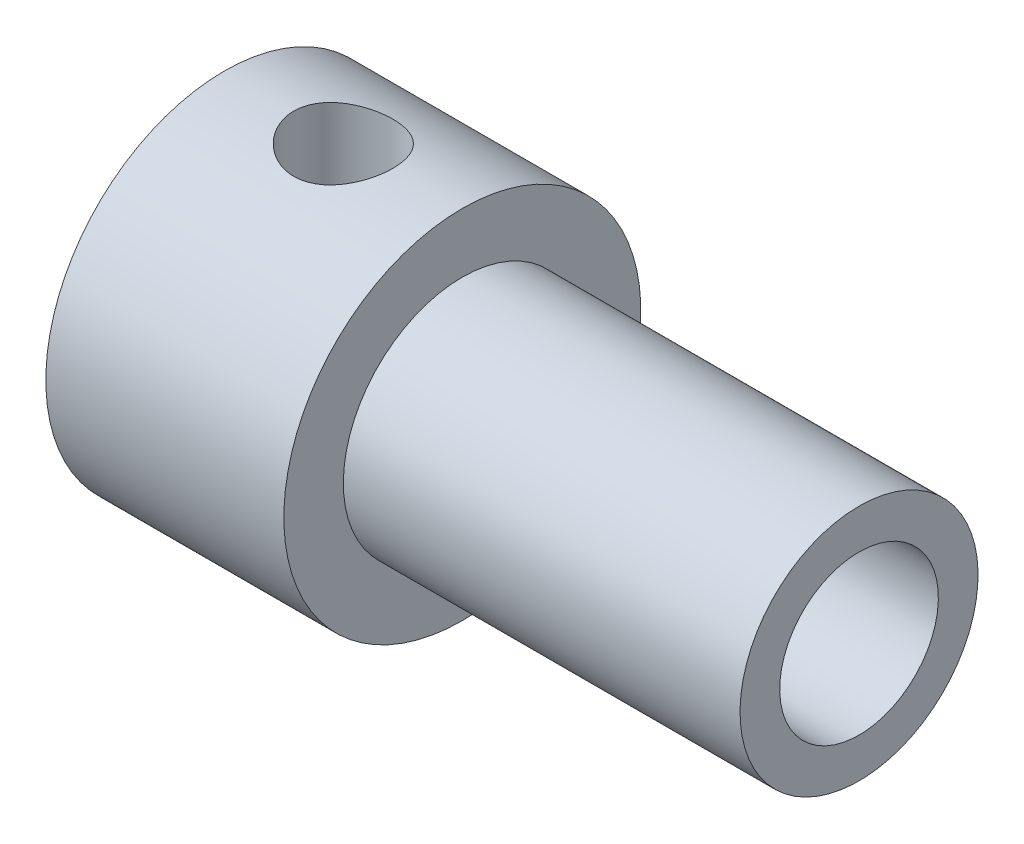
ISO-10303-21;
HEADER;
FILE_DESCRIPTION(('STEP AP214'),'2;1');
FILE_NAME('part.step','',(''),(''),'','','');
FILE_SCHEMA(('AUTOMOTIVE_DESIGN { 1 0 10303 214 1 1 1 1 }'));
ENDSEC;
DATA;
#1=APPLICATION_CONTEXT('core data for automotive mechanical design processes');
#2=APPLICATION_PROTOCOL_DEFINITION('international standard','automotive_design',2000,#1);
#3=PRODUCT_CONTEXT('',#1,'mechanical');
#4=PRODUCT('Part','Part','',(#3));
#5=PRODUCT_RELATED_PRODUCT_CATEGORY('part','',(#4));
#6=PRODUCT_DEFINITION_FORMATION('','',#4);
#7=PRODUCT_DEFINITION_CONTEXT('part definition',#1,'design');
#8=PRODUCT_DEFINITION('design','',#6,#7);
#9=PRODUCT_DEFINITION_SHAPE('','',#8);
#10=(LENGTH_UNIT() NAMED_UNIT(*) SI_UNIT(.MILLI.,.METRE.));
#11=(NAMED_UNIT(*) PLANE_ANGLE_UNIT() SI_UNIT($,.RADIAN.));
#12=(NAMED_UNIT(*) SI_UNIT($,.STERADIAN.) SOLID_ANGLE_UNIT());
#13=UNCERTAINTY_MEASURE_WITH_UNIT(LENGTH_MEASURE(1.E-05),#10,'distance_accuracy_value','');
#14=(GEOMETRIC_REPRESENTATION_CONTEXT(3) GLOBAL_UNCERTAINTY_ASSIGNED_CONTEXT((#13)) GLOBAL_UNIT_ASSIGNED_CONTEXT((#10,
#11,#12)) REPRESENTATION_CONTEXT('',''));
#15=CARTESIAN_POINT('',(0.,0.,0.));
#16=DIRECTION('',(0.,0.,1.));
#17=DIRECTION('',(1.,0.,0.));
#18=AXIS2_PLACEMENT_3D('',#15,#16,#17);
#19=CARTESIAN_POINT('',(0.,-2.,0.));
#20=DIRECTION('',(1.,0.,0.));
#21=DIRECTION('',(0.,1.,0.));
#22=AXIS2_PLACEMENT_3D('',#19,#20,#21);
#23=CYLINDRICAL_SURFACE('',#22,2.);
#24=CARTESIAN_POINT('',(-14.25,0.,0.));
#25=CARTESIAN_POINT('',(-14.2499956500012,-4.04694687398822E-06,-0.0635104730002027));
#26=CARTESIAN_POINT('',(-14.2451269881822,-0.00305676688999323,-0.127096441053758));
#27=CARTESIAN_POINT('',(-14.2259141965705,-0.0149783227589793,-0.252318262265282));
#28=CARTESIAN_POINT('',(-14.2115520060745,-0.0238582442510421,-0.313950163299073));
#29=CARTESIAN_POINT('',(-14.1741886368379,-0.0465414701786574,-0.433205558136783));
#30=CARTESIAN_POINT('',(-14.1512302121591,-0.0603203922133728,-0.490847243665017));
#31=CARTESIAN_POINT('',(-14.0976141492032,-0.0916540151392698,-0.60126036886836));
#32=CARTESIAN_POINT('',(-14.0669573639908,-0.10920829764729,-0.654032347276152));
#33=CARTESIAN_POINT('',(-13.996113426815,-0.148298470977271,-0.757974192167973));
#34=CARTESIAN_POINT('',(-13.9553607000245,-0.170040377753832,-0.808679560769977));
#35=CARTESIAN_POINT('',(-13.8667808254934,-0.214686500863683,-0.90298637514676));
#36=CARTESIAN_POINT('',(-13.8189441717421,-0.237592251414473,-0.946578107215733));
#37=CARTESIAN_POINT('',(-13.7099661057955,-0.285695813448014,-1.03142873237132));
#38=CARTESIAN_POINT('',(-13.6479002133927,-0.310783890065879,-1.07157206029151));
#39=CARTESIAN_POINT('',(-13.5164351845528,-0.35669801871269,-1.14073966020039));
#40=CARTESIAN_POINT('',(-13.4470486874239,-0.377531240037616,-1.16978270899534));
#41=CARTESIAN_POINT('',(-13.3211894762213,-0.406904243726358,-1.2093340058598));
#42=CARTESIAN_POINT('',(-13.2660331814612,-0.417230940099262,-1.22269552371393));
#43=CARTESIAN_POINT('',(-13.1536940743892,-0.432186426741945,-1.2418184358548));
#44=CARTESIAN_POINT('',(-13.0965142417255,-0.436823263263077,-1.24759056342088));
#45=CARTESIAN_POINT('',(-12.9815869832489,-0.439701142171729,-1.2511891824572));
#46=CARTESIAN_POINT('',(-12.9238384635376,-0.437925412282815,-1.24899483727851));
#47=CARTESIAN_POINT('',(-12.809689896811,-0.428225976160802,-1.23676317046804));
#48=CARTESIAN_POINT('',(-12.7532909679609,-0.420297342328898,-1.22671956265043));
#49=CARTESIAN_POINT('',(-12.6445615473425,-0.399674268782194,-1.19968103371474));
#50=CARTESIAN_POINT('',(-12.5921675443157,-0.387092848951863,-1.18285016736897));
#51=CARTESIAN_POINT('',(-12.4908388175946,-0.358544335565944,-1.14290189820938));
#52=CARTESIAN_POINT('',(-12.4419053251255,-0.342576044986466,-1.11978227193696));
#53=CARTESIAN_POINT('',(-12.3391667261673,-0.305451840069805,-1.06294892954949));
#54=CARTESIAN_POINT('',(-12.2861591898796,-0.283884084240411,-1.0280629660117));
#55=CARTESIAN_POINT('',(-12.1861697209995,-0.239942882087568,-0.950881463002103));
#56=CARTESIAN_POINT('',(-12.1391940682935,-0.217568626640245,-0.908578308011438));
#57=CARTESIAN_POINT('',(-12.0446982506296,-0.170201050831433,-0.809519713023332));
#58=CARTESIAN_POINT('',(-11.9983670257412,-0.145384683234071,-0.751531353595334));
#59=CARTESIAN_POINT('',(-11.9161491041128,-0.0997194493755531,-0.62714809959357));
#60=CARTESIAN_POINT('',(-11.8802583022711,-0.0788690248523625,-0.560756523881999));
#61=CARTESIAN_POINT('',(-11.8222363116186,-0.0444662703868383,-0.424883562934749));
#62=CARTESIAN_POINT('',(-11.7994659600188,-0.03058023408426,-0.355763457732371));
#63=CARTESIAN_POINT('',(-11.7662350720172,-0.0101507068995191,-0.213612154574977));
#64=CARTESIAN_POINT('',(-11.755757105778,-0.00359682009930077,-0.140586648341306));
#65=CARTESIAN_POINT('',(-11.7484341499388,0.000978405400911449,-0.00451561874059017));
#66=CARTESIAN_POINT('',(-11.7497968220461,0.000121613455105019,0.0584027741637829));
#67=CARTESIAN_POINT('',(-11.7618828284207,-0.00741098505673247,0.182972117996307));
#68=CARTESIAN_POINT('',(-11.7726055250922,-0.0140863952640859,0.244623154962732));
#69=CARTESIAN_POINT('',(-11.802238536692,-0.0322594771693028,0.362521070658188));
#70=CARTESIAN_POINT('',(-11.8208121567966,-0.0435582947315621,0.418885009953202));
#71=CARTESIAN_POINT('',(-11.8652963892786,-0.070043158952486,0.527638281070987));
#72=CARTESIAN_POINT('',(-11.8912082302552,-0.0852298564973361,0.580026945470713));
#73=CARTESIAN_POINT('',(-11.9525152059955,-0.120099876439996,0.685084056277256));
#74=CARTESIAN_POINT('',(-11.9886035692382,-0.140082351827755,0.737246967843403));
#75=CARTESIAN_POINT('',(-12.0677938651528,-0.181930299982833,0.83514264021734));
#76=CARTESIAN_POINT('',(-12.1109035892545,-0.20379785173616,0.880868151291853));
#77=CARTESIAN_POINT('',(-12.2101350394127,-0.250941302869087,0.971474198022882));
#78=CARTESIAN_POINT('',(-12.2672372062948,-0.276251165850429,1.01526851939752));
#79=CARTESIAN_POINT('',(-12.3888757849443,-0.324332372518279,1.09280351885684));
#80=CARTESIAN_POINT('',(-12.453407006753,-0.347105466776638,1.12655115718693));
#81=CARTESIAN_POINT('',(-12.5746921480569,-0.38266469685408,1.17684772011828));
#82=CARTESIAN_POINT('',(-12.6302407507322,-0.396543638062203,1.19551895865479));
#83=CARTESIAN_POINT('',(-12.7443931457689,-0.418949693362328,1.22500108205245));
#84=CARTESIAN_POINT('',(-12.8029920094515,-0.427485167573945,1.23582424983127));
#85=CARTESIAN_POINT('',(-12.9220902768807,-0.437936750112685,1.24901383653654));
#86=CARTESIAN_POINT('',(-12.9825985854882,-0.439814983254312,1.25133186963292));
#87=CARTESIAN_POINT('',(-13.103130960366,-0.436509368901527,1.24719778716817));
#88=CARTESIAN_POINT('',(-13.1631548590095,-0.431323174044142,1.24074275650142));
#89=CARTESIAN_POINT('',(-13.2760297950514,-0.41544611228666,1.22038272403399));
#90=CARTESIAN_POINT('',(-13.3290693014164,-0.405231919489398,1.2071191949977));
#91=CARTESIAN_POINT('',(-13.4321350595859,-0.380824695643097,1.17417623469513));
#92=CARTESIAN_POINT('',(-13.4821600445375,-0.366630005762726,1.15449412799407));
#93=CARTESIAN_POINT('',(-13.5855967438727,-0.333360971134819,1.10602690439618));
#94=CARTESIAN_POINT('',(-13.6384502984766,-0.313877695010031,1.0763364445546));
#95=CARTESIAN_POINT('',(-13.738938367246,-0.273322935881322,1.0100001703639));
#96=CARTESIAN_POINT('',(-13.7865686125605,-0.252250177231749,0.973348732866944));
#97=CARTESIAN_POINT('',(-13.8850142549778,-0.205980892688188,0.885670221416065));
#98=CARTESIAN_POINT('',(-13.9345908454455,-0.18079458191224,0.833233674246799));
#99=CARTESIAN_POINT('',(-14.0244948297052,-0.133012709432523,0.719822446025209));
#100=CARTESIAN_POINT('',(-14.0648164959274,-0.110418756356055,0.658842515138555));
#101=CARTESIAN_POINT('',(-14.1347711301241,-0.0701328902345195,0.529355399891413));
#102=CARTESIAN_POINT('',(-14.1643860054058,-0.0524492864464374,0.460835727056575));
#103=CARTESIAN_POINT('',(-14.2110718843317,-0.0241847836215768,0.318394712729504));
#104=CARTESIAN_POINT('',(-14.2281872348698,-0.0135787857131109,0.244493501106854));
#105=CARTESIAN_POINT('',(-14.2422992091626,-0.00480527831856997,0.141418481224667));
#106=CARTESIAN_POINT('',(-14.245181865334,-0.00300827773698841,0.113248608862872));
#107=CARTESIAN_POINT('',(-14.2490332915376,-0.000604697867604981,0.0567241864870907));
#108=CARTESIAN_POINT('',(-14.25000194311,1.80773910696459E-06,0.0283696251514532));
#109=CARTESIAN_POINT('',(-14.25,0.,0.));
#110=B_SPLINE_CURVE_WITH_KNOTS('',3,(#24,#25,#26,#27,#28,#29,#30,#31,#32,#33,#34,#35,#36,#37,
#38,#39,#40,#41,#42,#43,#44,#45,#46,#47,#48,#49,#50,#51,#52,#53,#54,#55,#56,#57,#58,#59,#60,#61,
#62,#63,#64,#65,#66,#67,#68,#69,#70,#71,#72,#73,#74,#75,#76,#77,#78,#79,#80,#81,#82,#83,#84,#85,
#86,#87,#88,#89,#90,#91,#92,#93,#94,#95,#96,#97,#98,#99,#100,#101,#102,#103,#104,#105,#106,#107,
#108,#109),.UNSPECIFIED.,.T.,.F.,(4,2,2,2,2,2,2,2,2,2,2,2,2,2,2,2,2,2,2,2,2,2,2,2,2,2,2,2,2,2,2,
2,2,2,2,2,2,2,2,2,2,2,4),(0.,0.190412301434133,0.381187894128462,0.571026987595136,
0.760845054038795,0.965821870536219,1.17107628325702,1.40412975852973,1.6367872460701,
1.80912008879717,1.98120894707391,2.15374823498778,2.32642584505083,2.49515839460436,
2.66395067908033,2.86427450354359,3.06480522575182,3.29842180699522,3.53194640727861,
3.75284174135959,3.9734234795813,4.16127180597572,4.3491073373228,4.52959504531298,
4.71011298928466,4.90885230990552,5.10781368827686,5.33565708863713,5.5633422719691,
5.7432994031372,5.92297427413352,6.103669746882,6.28442527563864,6.45063169037741,
6.61690747313442,6.80725523036979,6.99775741153769,7.22600539035111,7.45439424578499,
7.68316725607077,7.91112460944407,7.9961750123248,8.08123067890588),.UNSPECIFIED.);
#111=CARTESIAN_POINT('',(-14.25,0.,0.));
#112=VERTEX_POINT('',#111);
#113=EDGE_CURVE('E60',#112,#112,#110,.T.);
#114=ORIENTED_EDGE('',*,*,#113,.F.);
#115=EDGE_LOOP('',(#114));
#116=FACE_BOUND('',#115,.T.);
#117=CARTESIAN_POINT('',(0.,-2.,0.));
#118=DIRECTION('',(1.,0.,0.));
#119=DIRECTION('',(0.,1.,0.));
#120=AXIS2_PLACEMENT_3D('',#117,#118,#119);
#121=CIRCLE('',#120,2.);
#122=CARTESIAN_POINT('',(0.,0.,0.));
#123=VERTEX_POINT('',#122);
#124=EDGE_CURVE('E10',#123,#123,#121,.T.);
#125=ORIENTED_EDGE('',*,*,#124,.T.);
#126=EDGE_LOOP('',(#125));
#127=FACE_BOUND('',#126,.T.);
#128=CARTESIAN_POINT('',(-16.,-2.,0.));
#129=DIRECTION('',(1.,0.,0.));
#130=DIRECTION('',(0.,1.,0.));
#131=AXIS2_PLACEMENT_3D('',#128,#129,#130);
#132=CIRCLE('',#131,2.);
#133=CARTESIAN_POINT('',(-16.,0.,0.));
#134=VERTEX_POINT('',#133);
#135=EDGE_CURVE('E57',#134,#134,#132,.T.);
#136=ORIENTED_EDGE('',*,*,#135,.F.);
#137=EDGE_LOOP('',(#136));
#138=FACE_BOUND('',#137,.T.);
#139=ADVANCED_FACE('F30',(#116,#127,#138),#23,.F.);
#140=CARTESIAN_POINT('',(0.,0.,0.));
#141=DIRECTION('',(1.,0.,0.));
#142=DIRECTION('',(0.,1.,0.));
#143=AXIS2_PLACEMENT_3D('',#140,#141,#142);
#144=PLANE('',#143);
#145=CARTESIAN_POINT('',(0.,-2.,0.));
#146=DIRECTION('',(1.,0.,0.));
#147=DIRECTION('',(0.,1.,0.));
#148=AXIS2_PLACEMENT_3D('',#145,#146,#147);
#149=CIRCLE('',#148,3.);
#150=CARTESIAN_POINT('',(0.,1.,0.));
#151=VERTEX_POINT('',#150);
#152=EDGE_CURVE('E42',#151,#151,#149,.T.);
#153=ORIENTED_EDGE('',*,*,#152,.T.);
#154=EDGE_LOOP('',(#153));
#155=FACE_BOUND('',#154,.T.);
#156=ORIENTED_EDGE('',*,*,#124,.F.);
#157=EDGE_LOOP('',(#156));
#158=FACE_BOUND('',#157,.T.);
#159=ADVANCED_FACE('F84',(#155,#158),#144,.T.);
#160=CARTESIAN_POINT('',(0.,-2.,0.));
#161=DIRECTION('',(1.,0.,0.));
#162=DIRECTION('',(0.,1.,0.));
#163=AXIS2_PLACEMENT_3D('',#160,#161,#162);
#164=CYLINDRICAL_SURFACE('',#163,3.);
#165=CARTESIAN_POINT('',(-10.,-2.,0.));
#166=DIRECTION('',(1.,0.,0.));
#167=DIRECTION('',(0.,1.,0.));
#168=AXIS2_PLACEMENT_3D('',#165,#166,#167);
#169=CIRCLE('',#168,3.);
#170=CARTESIAN_POINT('',(-10.,0.999999999999999,0.));
#171=VERTEX_POINT('',#170);
#172=EDGE_CURVE('E46',#171,#171,#169,.T.);
#173=ORIENTED_EDGE('',*,*,#172,.T.);
#174=EDGE_LOOP('',(#173));
#175=FACE_BOUND('',#174,.T.);
#176=ORIENTED_EDGE('',*,*,#152,.F.);
#177=EDGE_LOOP('',(#176));
#178=FACE_BOUND('',#177,.T.);
#179=ADVANCED_FACE('F81',(#175,#178),#164,.T.);
#180=CARTESIAN_POINT('',(-10.,0.999999999999999,0.));
#181=DIRECTION('',(1.,0.,0.));
#182=DIRECTION('',(0.,1.,0.));
#183=AXIS2_PLACEMENT_3D('',#180,#181,#182);
#184=PLANE('',#183);
#185=CARTESIAN_POINT('',(-10.,-2.,0.));
#186=DIRECTION('',(1.,0.,0.));
#187=DIRECTION('',(0.,1.,0.));
#188=AXIS2_PLACEMENT_3D('',#185,#186,#187);
#189=CIRCLE('',#188,4.5);
#190=CARTESIAN_POINT('',(-10.,2.5,0.));
#191=VERTEX_POINT('',#190);
#192=EDGE_CURVE('E51',#191,#191,#189,.T.);
#193=ORIENTED_EDGE('',*,*,#192,.T.);
#194=EDGE_LOOP('',(#193));
#195=FACE_BOUND('',#194,.T.);
#196=ORIENTED_EDGE('',*,*,#172,.F.);
#197=EDGE_LOOP('',(#196));
#198=FACE_BOUND('',#197,.T.);
#199=ADVANCED_FACE('F77',(#195,#198),#184,.T.);
#200=CARTESIAN_POINT('',(0.,-2.,0.));
#201=DIRECTION('',(1.,0.,0.));
#202=DIRECTION('',(0.,1.,0.));
#203=AXIS2_PLACEMENT_3D('',#200,#201,#202);
#204=CYLINDRICAL_SURFACE('',#203,4.5);
#205=CARTESIAN_POINT('',(-14.25,2.5,0.));
#206=CARTESIAN_POINT('',(-14.2499986004148,2.49999908016929,0.0688012508831792));
#207=CARTESIAN_POINT('',(-14.2443006801947,2.49840674086832,0.137617123752667));
#208=CARTESIAN_POINT('',(-14.2217042717347,2.49220950198236,0.273259475994238));
#209=CARTESIAN_POINT('',(-14.2048010582863,2.48760333149253,0.340085103663439));
#210=CARTESIAN_POINT('',(-14.1603912805861,2.47588565394594,0.469769949680302));
#211=CARTESIAN_POINT('',(-14.1328990313016,2.46877753030963,0.53263439009567));
#212=CARTESIAN_POINT('',(-14.0681464936731,2.45280312581996,0.652860695241772));
#213=CARTESIAN_POINT('',(-14.0308853380807,2.44393668888688,0.710222070812296));
#214=CARTESIAN_POINT('',(-13.9466705661571,2.4251515781749,0.819246784715923));
#215=CARTESIAN_POINT('',(-13.8995179603125,2.41521373623696,0.870753112808473));
#216=CARTESIAN_POINT('',(-13.7972837228784,2.39552607117256,0.965238185696338));
#217=CARTESIAN_POINT('',(-13.7422009777248,2.38577627467017,1.00821573084554));
#218=CARTESIAN_POINT('',(-13.6243927398707,2.36737044294547,1.08520808580323));
#219=CARTESIAN_POINT('',(-13.5615427915563,2.35873847945984,1.11903874947837));
#220=CARTESIAN_POINT('',(-13.4307680823599,2.34382900808304,1.1755895713114));
#221=CARTESIAN_POINT('',(-13.3628443495918,2.33755102474248,1.19831197336242));
#222=CARTESIAN_POINT('',(-13.2255972111459,2.32825883142876,1.23144924367956));
#223=CARTESIAN_POINT('',(-13.1563481783601,2.32516886003198,1.24215036904296));
#224=CARTESIAN_POINT('',(-13.0169741144372,2.32237649384803,1.25183427077973));
#225=CARTESIAN_POINT('',(-12.9468492651188,2.3226734072502,1.25081944027303));
#226=CARTESIAN_POINT('',(-12.8099777212773,2.32655366801453,1.2373267133762));
#227=CARTESIAN_POINT('',(-12.7431931985038,2.33003660668585,1.22519902270671));
#228=CARTESIAN_POINT('',(-12.6126463714084,2.33973517053475,1.19038731201905));
#229=CARTESIAN_POINT('',(-12.5488843273977,2.3459510306134,1.16770238457158));
#230=CARTESIAN_POINT('',(-12.4252977685447,2.36050069775752,1.11214373134465));
#231=CARTESIAN_POINT('',(-12.3655301331899,2.36885918600197,1.07915021836991));
#232=CARTESIAN_POINT('',(-12.2522584244088,2.38673950684299,1.00399440679635));
#233=CARTESIAN_POINT('',(-12.1987556812739,2.39626158564315,0.961830166290601));
#234=CARTESIAN_POINT('',(-12.0975361195636,2.41581072126827,0.86775561028444));
#235=CARTESIAN_POINT('',(-12.0500923651201,2.42584370037791,0.815552279702355));
#236=CARTESIAN_POINT('',(-11.9645742692222,2.44498199810828,0.703806607201034));
#237=CARTESIAN_POINT('',(-11.9265003618975,2.45408727373461,0.644263925421965));
#238=CARTESIAN_POINT('',(-11.8606681843699,2.47040839712755,0.519083429338115));
#239=CARTESIAN_POINT('',(-11.8329628960611,2.47761448645531,0.453416395747748));
#240=CARTESIAN_POINT('',(-11.7890659015586,2.48925492501446,0.318109988769715));
#241=CARTESIAN_POINT('',(-11.7728714578434,2.49368993323699,0.248471564121131));
#242=CARTESIAN_POINT('',(-11.752892863221,2.49918736483408,0.109526607713142));
#243=CARTESIAN_POINT('',(-11.7487378550928,2.5003505382403,0.0402773058586813));
#244=CARTESIAN_POINT('',(-11.7519269982924,2.49946480293159,-0.0979299306365671));
#245=CARTESIAN_POINT('',(-11.759269851648,2.49741625678167,-0.166887897284518));
#246=CARTESIAN_POINT('',(-11.7849433341196,2.49040265059028,-0.30120691347086));
#247=CARTESIAN_POINT('',(-11.8030639450575,2.4854933716758,-0.366611288163867));
#248=CARTESIAN_POINT('',(-11.8495318676381,2.47331829169354,-0.493443118118721));
#249=CARTESIAN_POINT('',(-11.8778803325695,2.46605222488463,-0.554870123972382));
#250=CARTESIAN_POINT('',(-11.9446658780465,2.44973740284175,-0.673420140405415));
#251=CARTESIAN_POINT('',(-11.9833005243227,2.44065471340565,-0.73042706195354));
#252=CARTESIAN_POINT('',(-12.0693161358075,2.42175477128212,-0.837277670586999));
#253=CARTESIAN_POINT('',(-12.1166989800658,2.41193736105189,-0.887119814631375));
#254=CARTESIAN_POINT('',(-12.2206014438783,2.39229842684379,-0.979812026944951));
#255=CARTESIAN_POINT('',(-12.2773574515576,2.3824860820796,-1.02239957885383));
#256=CARTESIAN_POINT('',(-12.3974206378797,2.36429693304267,-1.09745581429008));
#257=CARTESIAN_POINT('',(-12.4607275658426,2.35592007387163,-1.12992488482463));
#258=CARTESIAN_POINT('',(-12.5918071698832,2.34164798956173,-1.18358105834153));
#259=CARTESIAN_POINT('',(-12.6595526377546,2.3357390309604,-1.20483077484783));
#260=CARTESIAN_POINT('',(-12.7978497094168,2.32707876892783,-1.23557652495357));
#261=CARTESIAN_POINT('',(-12.8684005146331,2.32432657344886,-1.24507587906573));
#262=CARTESIAN_POINT('',(-13.0076057794908,2.32237038329875,-1.25184859974321));
#263=CARTESIAN_POINT('',(-13.0762381900119,2.32304340461176,-1.24954571014582));
#264=CARTESIAN_POINT('',(-13.2120948937947,2.32757137052123,-1.23377143287258));
#265=CARTESIAN_POINT('',(-13.2793192292682,2.33142621959091,-1.2203003804941));
#266=CARTESIAN_POINT('',(-13.4098672339181,2.34180718808002,-1.18282724248615));
#267=CARTESIAN_POINT('',(-13.4732208426478,2.34830866913275,-1.15892214641117));
#268=CARTESIAN_POINT('',(-13.5950674225073,2.36324916052053,-1.10133451670734));
#269=CARTESIAN_POINT('',(-13.6535595714857,2.37168849767404,-1.06765033358688));
#270=CARTESIAN_POINT('',(-13.7660276528252,2.38988810785379,-0.990206962020973));
#271=CARTESIAN_POINT('',(-13.8198014766827,2.39968178982261,-0.946162084346266));
#272=CARTESIAN_POINT('',(-13.9193323720535,2.41930831909362,-0.849781527450663));
#273=CARTESIAN_POINT('',(-13.965087452891,2.4291411755031,-0.797443795628192));
#274=CARTESIAN_POINT('',(-14.0483581365781,2.44801839581548,-0.684460232307882));
#275=CARTESIAN_POINT('',(-14.0856516233107,2.45703841192791,-0.623646258932174));
#276=CARTESIAN_POINT('',(-14.1494281392895,2.47299974900605,-0.496361982692841));
#277=CARTESIAN_POINT('',(-14.175917518581,2.47994229035335,-0.429895030176725));
#278=CARTESIAN_POINT('',(-14.2142200807347,2.4901607483195,-0.3031454837667));
#279=CARTESIAN_POINT('',(-14.2276047875929,2.49382245661855,-0.243364402168741));
#280=CARTESIAN_POINT('',(-14.2454948458225,2.49874234976284,-0.122392625693409));
#281=CARTESIAN_POINT('',(-14.2500012449999,2.50000081823467,-0.0612020980194152));
#282=CARTESIAN_POINT('',(-14.25,2.5,0.));
#283=B_SPLINE_CURVE_WITH_KNOTS('',3,(#205,#206,#207,#208,#209,#210,#211,#212,#213,#214,#215,
#216,#217,#218,#219,#220,#221,#222,#223,#224,#225,#226,#227,#228,#229,#230,#231,#232,#233,#234,
#235,#236,#237,#238,#239,#240,#241,#242,#243,#244,#245,#246,#247,#248,#249,#250,#251,#252,#253,
#254,#255,#256,#257,#258,#259,#260,#261,#262,#263,#264,#265,#266,#267,#268,#269,#270,#271,#272,
#273,#274,#275,#276,#277,#278,#279,#280,#281,#282),.UNSPECIFIED.,.T.,.F.,(4,2,2,2,2,2,2,2,2,2,2,
2,2,2,2,2,2,2,2,2,2,2,2,2,2,2,2,2,2,2,2,2,2,2,2,2,2,2,4),(0.,0.20617919309949,0.41244538614726,
0.618433707942855,0.824440322837931,1.03507624325264,1.24574177043995,1.46037690323672,
1.67496866133384,1.88433431939189,2.09365721284144,2.29660232990422,2.49956489399153,
2.70497960040655,2.91043784592675,3.12319493838162,3.33596188658146,3.54980165635949,
3.76359055350007,3.97072010588426,4.17782627748477,4.38102317477486,4.58424299163038,
4.79168948884226,4.99918059600964,5.21305991702851,5.426931056682,5.63959564853972,
5.85220013017266,6.05722599244307,6.26224569952548,6.46539893556024,6.66858645848128,
6.8782191327377,7.0879037754062,7.30258090584732,7.51713167871718,7.70055986525029,
7.88396640253934),.UNSPECIFIED.);
#284=CARTESIAN_POINT('',(-14.25,2.5,0.));
#285=VERTEX_POINT('',#284);
#286=EDGE_CURVE('E34',#285,#285,#283,.T.);
#287=ORIENTED_EDGE('',*,*,#286,.F.);
#288=EDGE_LOOP('',(#287));
#289=FACE_BOUND('',#288,.T.);
#290=CARTESIAN_POINT('',(-16.,-2.,0.));
#291=DIRECTION('',(1.,0.,0.));
#292=DIRECTION('',(0.,1.,0.));
#293=AXIS2_PLACEMENT_3D('',#290,#291,#292);
#294=CIRCLE('',#293,4.5);
#295=CARTESIAN_POINT('',(-16.,2.5,0.));
#296=VERTEX_POINT('',#295);
#297=EDGE_CURVE('E54',#296,#296,#294,.T.);
#298=ORIENTED_EDGE('',*,*,#297,.T.);
#299=EDGE_LOOP('',(#298));
#300=FACE_BOUND('',#299,.T.);
#301=ORIENTED_EDGE('',*,*,#192,.F.);
#302=EDGE_LOOP('',(#301));
#303=FACE_BOUND('',#302,.T.);
#304=ADVANCED_FACE('F72',(#289,#300,#303),#204,.T.);
#305=CARTESIAN_POINT('',(-16.,2.5,0.));
#306=DIRECTION('',(-1.,0.,0.));
#307=DIRECTION('',(0.,-1.,0.));
#308=AXIS2_PLACEMENT_3D('',#305,#306,#307);
#309=PLANE('',#308);
#310=ORIENTED_EDGE('',*,*,#135,.T.);
#311=EDGE_LOOP('',(#310));
#312=FACE_BOUND('',#311,.T.);
#313=ORIENTED_EDGE('',*,*,#297,.F.);
#314=EDGE_LOOP('',(#313));
#315=FACE_BOUND('',#314,.T.);
#316=ADVANCED_FACE('F68',(#312,#315),#309,.T.);
#317=CARTESIAN_POINT('',(-13.,-3.,0.));
#318=DIRECTION('',(0.,1.,0.));
#319=DIRECTION('',(0.,0.,1.));
#320=AXIS2_PLACEMENT_3D('',#317,#318,#319);
#321=CYLINDRICAL_SURFACE('',#320,1.25);
#322=ORIENTED_EDGE('',*,*,#113,.T.);
#323=EDGE_LOOP('',(#322));
#324=FACE_BOUND('',#323,.T.);
#325=ORIENTED_EDGE('',*,*,#286,.T.);
#326=EDGE_LOOP('',(#325));
#327=FACE_BOUND('',#326,.T.);
#328=ADVANCED_FACE('F64',(#324,#327),#321,.F.);
#329=CLOSED_SHELL('',(#139,#159,#179,#199,#304,#316,#328));
#330=MANIFOLD_SOLID_BREP('B2',#329);
#331=ADVANCED_BREP_SHAPE_REPRESENTATION('',(#18,#330),#14);
#332=SHAPE_DEFINITION_REPRESENTATION(#9,#331);
ENDSEC;
END-ISO-10303-21;
